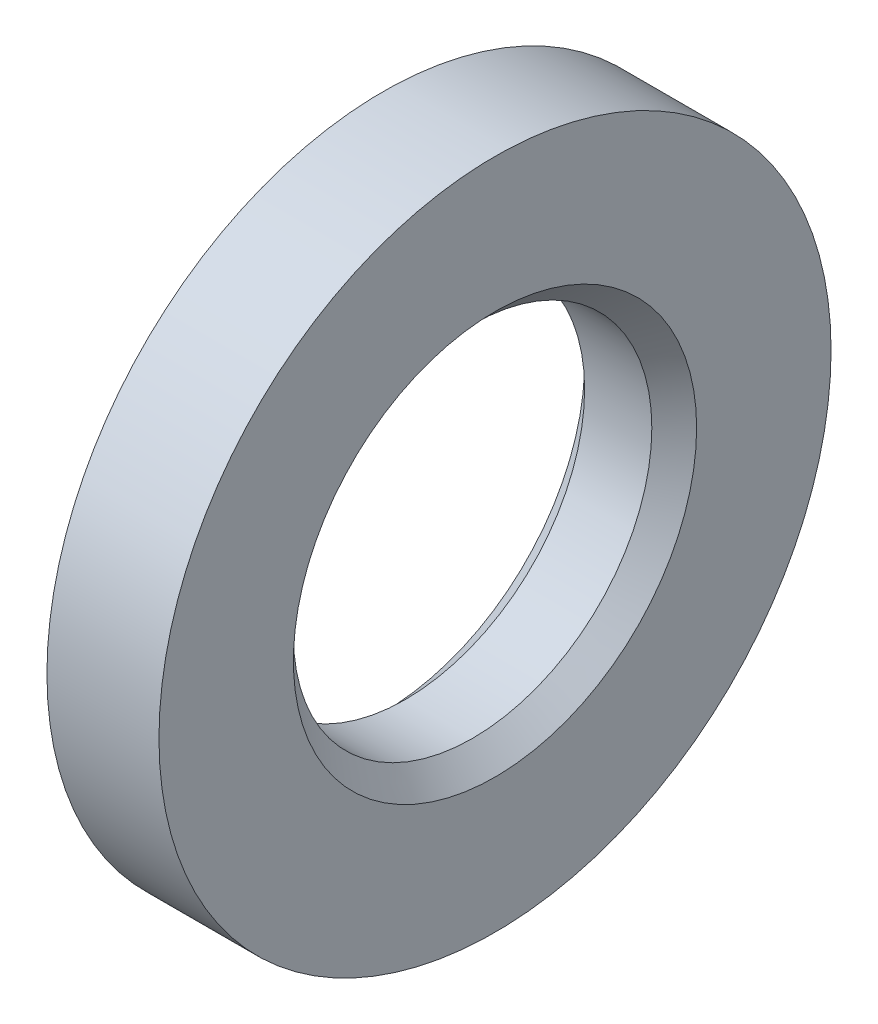
ISO-10303-21;
HEADER;
FILE_DESCRIPTION(('STEP AP214'),'2;1');
FILE_NAME('part.step','',(''),(''),'','','');
FILE_SCHEMA(('AUTOMOTIVE_DESIGN { 1 0 10303 214 1 1 1 1 }'));
ENDSEC;
DATA;
#1=APPLICATION_CONTEXT('core data for automotive mechanical design processes');
#2=APPLICATION_PROTOCOL_DEFINITION('international standard','automotive_design',2000,#1);
#3=PRODUCT_CONTEXT('',#1,'mechanical');
#4=PRODUCT('Part','Part','',(#3));
#5=PRODUCT_RELATED_PRODUCT_CATEGORY('part','',(#4));
#6=PRODUCT_DEFINITION_FORMATION('','',#4);
#7=PRODUCT_DEFINITION_CONTEXT('part definition',#1,'design');
#8=PRODUCT_DEFINITION('design','',#6,#7);
#9=PRODUCT_DEFINITION_SHAPE('','',#8);
#10=(LENGTH_UNIT() NAMED_UNIT(*) SI_UNIT(.MILLI.,.METRE.));
#11=(NAMED_UNIT(*) PLANE_ANGLE_UNIT() SI_UNIT($,.RADIAN.));
#12=(NAMED_UNIT(*) SI_UNIT($,.STERADIAN.) SOLID_ANGLE_UNIT());
#13=UNCERTAINTY_MEASURE_WITH_UNIT(LENGTH_MEASURE(1.E-05),#10,'distance_accuracy_value','');
#14=(GEOMETRIC_REPRESENTATION_CONTEXT(3) GLOBAL_UNCERTAINTY_ASSIGNED_CONTEXT((#13)) GLOBAL_UNIT_ASSIGNED_CONTEXT((#10,
#11,#12)) REPRESENTATION_CONTEXT('',''));
#15=CARTESIAN_POINT('',(0.,0.,0.));
#16=DIRECTION('',(0.,0.,1.));
#17=DIRECTION('',(1.,0.,0.));
#18=AXIS2_PLACEMENT_3D('',#15,#16,#17);
#19=CARTESIAN_POINT('',(-7.54400374531753,0.,0.));
#20=DIRECTION('',(1.,0.,0.));
#21=DIRECTION('',(0.,0.,-1.));
#22=AXIS2_PLACEMENT_3D('',#19,#20,#21);
#23=CYLINDRICAL_SURFACE('',#22,1.6);
#24=CARTESIAN_POINT('',(0.200000000006639,0.,0.));
#25=DIRECTION('',(-1.,0.,0.));
#26=DIRECTION('',(0.,0.,-1.));
#27=AXIS2_PLACEMENT_3D('',#24,#25,#26);
#28=CIRCLE('',#27,1.59999999999627);
#29=CARTESIAN_POINT('',(0.200000000006639,0.,-1.59999999999627));
#30=VERTEX_POINT('',#29);
#31=EDGE_CURVE('E36',#30,#30,#28,.T.);
#32=ORIENTED_EDGE('',*,*,#31,.T.);
#33=EDGE_LOOP('',(#32));
#34=FACE_BOUND('',#33,.T.);
#35=CARTESIAN_POINT('',(0.799999999969714,0.,0.));
#36=DIRECTION('',(1.,0.,0.));
#37=DIRECTION('',(0.,0.,1.));
#38=AXIS2_PLACEMENT_3D('',#35,#36,#37);
#39=CIRCLE('',#38,1.59999999999627);
#40=CARTESIAN_POINT('',(0.799999999969714,0.,1.59999999999627));
#41=VERTEX_POINT('',#40);
#42=EDGE_CURVE('E40',#41,#41,#39,.T.);
#43=ORIENTED_EDGE('',*,*,#42,.T.);
#44=EDGE_LOOP('',(#43));
#45=FACE_BOUND('',#44,.T.);
#46=ADVANCED_FACE('F15',(#34,#45),#23,.F.);
#47=CARTESIAN_POINT('',(1.0000000000332,0.,0.));
#48=DIRECTION('',(1.,0.,0.));
#49=DIRECTION('',(0.,0.,-1.));
#50=AXIS2_PLACEMENT_3D('',#47,#48,#49);
#51=CONICAL_SURFACE('',#50,1.80000000005975,0.785398163397448);
#52=CARTESIAN_POINT('',(1.0000000000332,0.,0.));
#53=DIRECTION('',(1.,0.,0.));
#54=DIRECTION('',(0.,0.,-1.));
#55=AXIS2_PLACEMENT_3D('',#52,#53,#54);
#56=CIRCLE('',#55,1.80000000005975);
#57=CARTESIAN_POINT('',(1.0000000000332,0.,-1.80000000005975));
#58=VERTEX_POINT('',#57);
#59=EDGE_CURVE('E18',#58,#58,#56,.F.);
#60=ORIENTED_EDGE('',*,*,#59,.F.);
#61=EDGE_LOOP('',(#60));
#62=FACE_BOUND('',#61,.T.);
#63=ORIENTED_EDGE('',*,*,#42,.F.);
#64=EDGE_LOOP('',(#63));
#65=FACE_BOUND('',#64,.T.);
#66=ADVANCED_FACE('F50',(#62,#65),#51,.F.);
#67=CARTESIAN_POINT('',(5.6843418860808E-11,0.,0.));
#68=DIRECTION('',(-1.,0.,0.));
#69=DIRECTION('',(0.,0.,1.));
#70=AXIS2_PLACEMENT_3D('',#67,#68,#69);
#71=CONICAL_SURFACE('',#70,1.79999999994607,0.785398163397448);
#72=CARTESIAN_POINT('',(5.6843418860808E-11,0.,0.));
#73=DIRECTION('',(-1.,0.,0.));
#74=DIRECTION('',(0.,0.,1.));
#75=AXIS2_PLACEMENT_3D('',#72,#73,#74);
#76=CIRCLE('',#75,1.79999999994607);
#77=CARTESIAN_POINT('',(5.6843418860808E-11,0.,1.79999999994607));
#78=VERTEX_POINT('',#77);
#79=EDGE_CURVE('E27',#78,#78,#76,.T.);
#80=ORIENTED_EDGE('',*,*,#79,.T.);
#81=EDGE_LOOP('',(#80));
#82=FACE_BOUND('',#81,.T.);
#83=ORIENTED_EDGE('',*,*,#31,.F.);
#84=EDGE_LOOP('',(#83));
#85=FACE_BOUND('',#84,.T.);
#86=ADVANCED_FACE('F52',(#82,#85),#71,.F.);
#87=CARTESIAN_POINT('',(1.,0.,0.));
#88=DIRECTION('',(1.,0.,0.));
#89=DIRECTION('',(0.,0.,-1.));
#90=AXIS2_PLACEMENT_3D('',#87,#88,#89);
#91=PLANE('',#90);
#92=ORIENTED_EDGE('',*,*,#59,.T.);
#93=EDGE_LOOP('',(#92));
#94=FACE_BOUND('',#93,.T.);
#95=CARTESIAN_POINT('',(1.,0.,0.));
#96=DIRECTION('',(1.,0.,0.));
#97=DIRECTION('',(0.,0.,-1.));
#98=AXIS2_PLACEMENT_3D('',#95,#96,#97);
#99=CIRCLE('',#98,3.);
#100=CARTESIAN_POINT('',(1.,0.,-3.));
#101=VERTEX_POINT('',#100);
#102=EDGE_CURVE('E22',#101,#101,#99,.F.);
#103=ORIENTED_EDGE('',*,*,#102,.F.);
#104=EDGE_LOOP('',(#103));
#105=FACE_BOUND('',#104,.T.);
#106=ADVANCED_FACE('F59',(#94,#105),#91,.T.);
#107=CARTESIAN_POINT('',(0.,0.,0.));
#108=DIRECTION('',(1.,0.,0.));
#109=DIRECTION('',(0.,0.,-1.));
#110=AXIS2_PLACEMENT_3D('',#107,#108,#109);
#111=PLANE('',#110);
#112=ORIENTED_EDGE('',*,*,#79,.F.);
#113=EDGE_LOOP('',(#112));
#114=FACE_BOUND('',#113,.T.);
#115=CARTESIAN_POINT('',(0.,0.,0.));
#116=DIRECTION('',(1.,0.,0.));
#117=DIRECTION('',(0.,0.,-1.));
#118=AXIS2_PLACEMENT_3D('',#115,#116,#117);
#119=CIRCLE('',#118,3.);
#120=CARTESIAN_POINT('',(0.,0.,-3.));
#121=VERTEX_POINT('',#120);
#122=EDGE_CURVE('E10',#121,#121,#119,.T.);
#123=ORIENTED_EDGE('',*,*,#122,.F.);
#124=EDGE_LOOP('',(#123));
#125=FACE_BOUND('',#124,.T.);
#126=ADVANCED_FACE('F63',(#114,#125),#111,.F.);
#127=CARTESIAN_POINT('',(0.,0.,0.));
#128=DIRECTION('',(1.,0.,0.));
#129=DIRECTION('',(0.,0.,-1.));
#130=AXIS2_PLACEMENT_3D('',#127,#128,#129);
#131=CYLINDRICAL_SURFACE('',#130,3.);
#132=ORIENTED_EDGE('',*,*,#122,.T.);
#133=EDGE_LOOP('',(#132));
#134=FACE_BOUND('',#133,.T.);
#135=ORIENTED_EDGE('',*,*,#102,.T.);
#136=EDGE_LOOP('',(#135));
#137=FACE_BOUND('',#136,.T.);
#138=ADVANCED_FACE('F61',(#134,#137),#131,.T.);
#139=CLOSED_SHELL('',(#46,#66,#86,#106,#126,#138));
#140=MANIFOLD_SOLID_BREP('B1',#139);
#141=ADVANCED_BREP_SHAPE_REPRESENTATION('',(#18,#140),#14);
#142=SHAPE_DEFINITION_REPRESENTATION(#9,#141);
ENDSEC;
END-ISO-10303-21;
